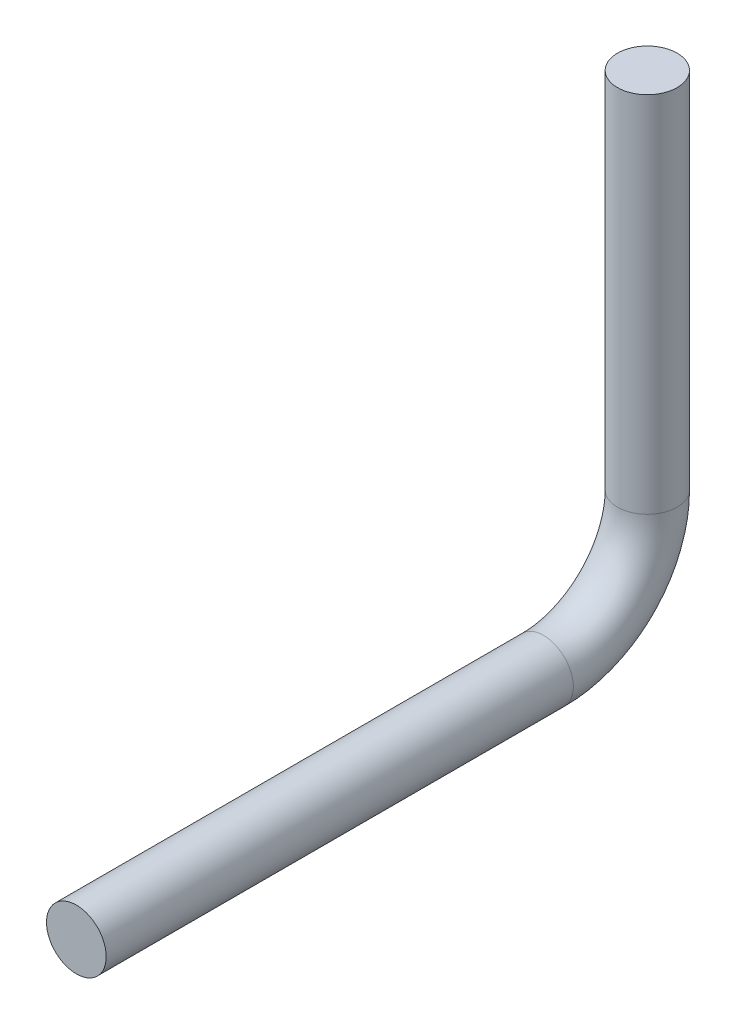
ISO-10303-21;
HEADER;
FILE_DESCRIPTION(('STEP AP214'),'2;1');
FILE_NAME('part.step','',(''),(''),'','','');
FILE_SCHEMA(('AUTOMOTIVE_DESIGN { 1 0 10303 214 1 1 1 1 }'));
ENDSEC;
DATA;
#1=APPLICATION_CONTEXT('core data for automotive mechanical design processes');
#2=APPLICATION_PROTOCOL_DEFINITION('international standard','automotive_design',2000,#1);
#3=PRODUCT_CONTEXT('',#1,'mechanical');
#4=PRODUCT('Part','Part','',(#3));
#5=PRODUCT_RELATED_PRODUCT_CATEGORY('part','',(#4));
#6=PRODUCT_DEFINITION_FORMATION('','',#4);
#7=PRODUCT_DEFINITION_CONTEXT('part definition',#1,'design');
#8=PRODUCT_DEFINITION('design','',#6,#7);
#9=PRODUCT_DEFINITION_SHAPE('','',#8);
#10=(LENGTH_UNIT() NAMED_UNIT(*) SI_UNIT(.MILLI.,.METRE.));
#11=(NAMED_UNIT(*) PLANE_ANGLE_UNIT() SI_UNIT($,.RADIAN.));
#12=(NAMED_UNIT(*) SI_UNIT($,.STERADIAN.) SOLID_ANGLE_UNIT());
#13=UNCERTAINTY_MEASURE_WITH_UNIT(LENGTH_MEASURE(1.E-05),#10,'distance_accuracy_value','');
#14=(GEOMETRIC_REPRESENTATION_CONTEXT(3) GLOBAL_UNCERTAINTY_ASSIGNED_CONTEXT((#13)) GLOBAL_UNIT_ASSIGNED_CONTEXT((#10,
#11,#12)) REPRESENTATION_CONTEXT('',''));
#15=CARTESIAN_POINT('',(0.,0.,0.));
#16=DIRECTION('',(0.,0.,1.));
#17=DIRECTION('',(1.,0.,0.));
#18=AXIS2_PLACEMENT_3D('',#15,#16,#17);
#19=CARTESIAN_POINT('',(0.,0.,139.7));
#20=DIRECTION('',(0.,0.,1.));
#21=DIRECTION('',(1.,0.,0.));
#22=AXIS2_PLACEMENT_3D('',#19,#20,#21);
#23=PLANE('',#22);
#24=CARTESIAN_POINT('',(0.,0.,139.7));
#25=DIRECTION('',(0.,0.,1.));
#26=DIRECTION('',(1.,0.,0.));
#27=AXIS2_PLACEMENT_3D('',#24,#25,#26);
#28=CIRCLE('',#27,7.3025);
#29=CARTESIAN_POINT('',(7.3025,0.,139.7));
#30=VERTEX_POINT('',#29);
#31=EDGE_CURVE('E55',#30,#30,#28,.T.);
#32=ORIENTED_EDGE('',*,*,#31,.T.);
#33=EDGE_LOOP('',(#32));
#34=FACE_BOUND('',#33,.T.);
#35=ADVANCED_FACE('F43',(#34),#23,.T.);
#36=CARTESIAN_POINT('',(0.,114.3,0.));
#37=DIRECTION('',(0.,-1.,0.));
#38=DIRECTION('',(1.,0.,0.));
#39=AXIS2_PLACEMENT_3D('',#36,#37,#38);
#40=PLANE('',#39);
#41=CARTESIAN_POINT('',(0.,114.3,0.));
#42=DIRECTION('',(0.,-1.,0.));
#43=DIRECTION('',(1.,0.,0.));
#44=AXIS2_PLACEMENT_3D('',#41,#42,#43);
#45=CIRCLE('',#44,7.3025);
#46=CARTESIAN_POINT('',(7.3025,114.3,0.));
#47=VERTEX_POINT('',#46);
#48=EDGE_CURVE('E13',#47,#47,#45,.T.);
#49=ORIENTED_EDGE('',*,*,#48,.F.);
#50=EDGE_LOOP('',(#49));
#51=FACE_BOUND('',#50,.T.);
#52=ADVANCED_FACE('F61',(#51),#40,.F.);
#53=CARTESIAN_POINT('',(0.,0.,139.7));
#54=DIRECTION('',(0.,0.,-1.));
#55=DIRECTION('',(-1.,0.,0.));
#56=AXIS2_PLACEMENT_3D('',#53,#54,#55);
#57=CYLINDRICAL_SURFACE('',#56,7.3025);
#58=CARTESIAN_POINT('',(0.,0.,25.4));
#59=DIRECTION('',(0.,0.,1.));
#60=DIRECTION('',(1.,0.,0.));
#61=AXIS2_PLACEMENT_3D('',#58,#59,#60);
#62=CIRCLE('',#61,7.3025);
#63=CARTESIAN_POINT('',(0.,-7.30250000000002,25.4));
#64=VERTEX_POINT('',#63);
#65=EDGE_CURVE('E86',#64,#64,#62,.T.);
#66=ORIENTED_EDGE('',*,*,#65,.T.);
#67=EDGE_LOOP('',(#66));
#68=FACE_BOUND('',#67,.T.);
#69=ORIENTED_EDGE('',*,*,#31,.F.);
#70=EDGE_LOOP('',(#69));
#71=FACE_BOUND('',#70,.T.);
#72=ADVANCED_FACE('F63',(#68,#71),#57,.T.);
#73=CARTESIAN_POINT('',(0.,25.4,25.4));
#74=DIRECTION('',(1.,0.,0.));
#75=DIRECTION('',(0.,0.,-1.));
#76=AXIS2_PLACEMENT_3D('',#73,#74,#75);
#77=TOROIDAL_SURFACE('',#76,25.4,7.3025);
#78=CARTESIAN_POINT('',(0.,25.4,0.));
#79=DIRECTION('',(0.,-1.,0.));
#80=DIRECTION('',(1.,0.,0.));
#81=AXIS2_PLACEMENT_3D('',#78,#79,#80);
#82=CIRCLE('',#81,7.3025);
#83=CARTESIAN_POINT('',(0.,25.4,-7.30250000000001));
#84=VERTEX_POINT('',#83);
#85=EDGE_CURVE('E50',#84,#84,#82,.T.);
#86=CARTESIAN_POINT('',(0.,25.4,25.4));
#87=DIRECTION('',(1.,0.,0.));
#88=DIRECTION('',(0.,0.,-1.));
#89=AXIS2_PLACEMENT_3D('',#86,#87,#88);
#90=CIRCLE('',#89,32.7025);
#91=EDGE_CURVE('',#64,#84,#90,.T.);
#92=ORIENTED_EDGE('',*,*,#65,.F.);
#93=ORIENTED_EDGE('',*,*,#85,.T.);
#94=ORIENTED_EDGE('',*,*,#91,.T.);
#95=ORIENTED_EDGE('',*,*,#91,.F.);
#96=EDGE_LOOP('',(#92,#94,#93,#95));
#97=FACE_BOUND('',#96,.T.);
#98=ADVANCED_FACE('F68',(#97),#77,.T.);
#99=CARTESIAN_POINT('',(0.,25.4,0.));
#100=DIRECTION('',(0.,1.,0.));
#101=DIRECTION('',(0.,0.,1.));
#102=AXIS2_PLACEMENT_3D('',#99,#100,#101);
#103=CYLINDRICAL_SURFACE('',#102,7.3025);
#104=ORIENTED_EDGE('',*,*,#48,.T.);
#105=EDGE_LOOP('',(#104));
#106=FACE_BOUND('',#105,.T.);
#107=ORIENTED_EDGE('',*,*,#85,.F.);
#108=EDGE_LOOP('',(#107));
#109=FACE_BOUND('',#108,.T.);
#110=ADVANCED_FACE('F58',(#106,#109),#103,.T.);
#111=CLOSED_SHELL('',(#35,#52,#72,#98,#110));
#112=MANIFOLD_SOLID_BREP('B2',#111);
#113=ADVANCED_BREP_SHAPE_REPRESENTATION('',(#18,#112),#14);
#114=SHAPE_DEFINITION_REPRESENTATION(#9,#113);
ENDSEC;
END-ISO-10303-21;
